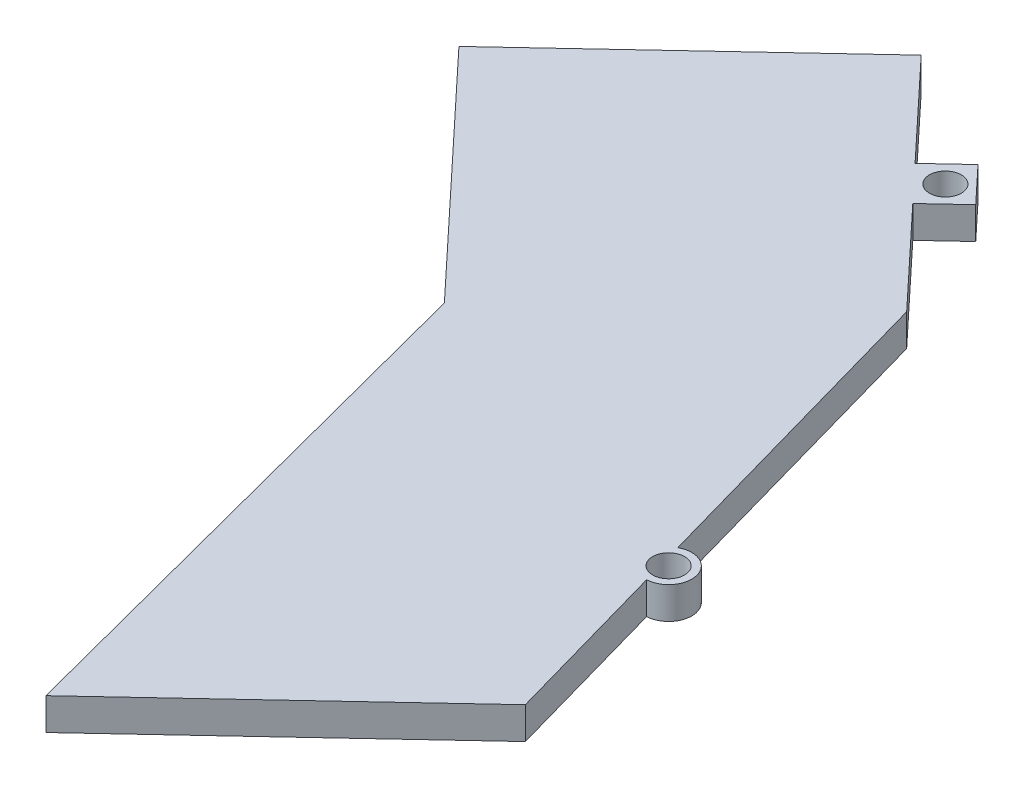
ISO-10303-21;
HEADER;
FILE_DESCRIPTION(('STEP AP214'),'2;1');
FILE_NAME('part.step','',(''),(''),'','','');
FILE_SCHEMA(('AUTOMOTIVE_DESIGN { 1 0 10303 214 1 1 1 1 }'));
ENDSEC;
DATA;
#1=APPLICATION_CONTEXT('core data for automotive mechanical design processes');
#2=APPLICATION_PROTOCOL_DEFINITION('international standard','automotive_design',2000,#1);
#3=PRODUCT_CONTEXT('',#1,'mechanical');
#4=PRODUCT('Part','Part','',(#3));
#5=PRODUCT_RELATED_PRODUCT_CATEGORY('part','',(#4));
#6=PRODUCT_DEFINITION_FORMATION('','',#4);
#7=PRODUCT_DEFINITION_CONTEXT('part definition',#1,'design');
#8=PRODUCT_DEFINITION('design','',#6,#7);
#9=PRODUCT_DEFINITION_SHAPE('','',#8);
#10=(LENGTH_UNIT() NAMED_UNIT(*) SI_UNIT(.MILLI.,.METRE.));
#11=(NAMED_UNIT(*) PLANE_ANGLE_UNIT() SI_UNIT($,.RADIAN.));
#12=(NAMED_UNIT(*) SI_UNIT($,.STERADIAN.) SOLID_ANGLE_UNIT());
#13=UNCERTAINTY_MEASURE_WITH_UNIT(LENGTH_MEASURE(1.E-05),#10,'distance_accuracy_value','');
#14=(GEOMETRIC_REPRESENTATION_CONTEXT(3) GLOBAL_UNCERTAINTY_ASSIGNED_CONTEXT((#13)) GLOBAL_UNIT_ASSIGNED_CONTEXT((#10,
#11,#12)) REPRESENTATION_CONTEXT('',''));
#15=CARTESIAN_POINT('',(0.,0.,0.));
#16=DIRECTION('',(0.,0.,1.));
#17=DIRECTION('',(1.,0.,0.));
#18=AXIS2_PLACEMENT_3D('',#15,#16,#17);
#19=CARTESIAN_POINT('',(50.3088874652439,6.35,14.3896305816045));
#20=DIRECTION('',(0.,1.,0.));
#21=DIRECTION('',(0.,0.,1.));
#22=AXIS2_PLACEMENT_3D('',#19,#20,#21);
#23=PLANE('',#22);
#24=CARTESIAN_POINT('',(50.3088874652439,6.35,14.3896305816045));
#25=DIRECTION('',(0.,1.,0.));
#26=DIRECTION('',(0.,0.,1.));
#27=AXIS2_PLACEMENT_3D('',#24,#25,#26);
#28=CIRCLE('',#27,3.175);
#29=CARTESIAN_POINT('',(50.3088874652439,6.35,17.5646305816045));
#30=VERTEX_POINT('',#29);
#31=EDGE_CURVE('E170',#30,#30,#28,.T.);
#32=ORIENTED_EDGE('',*,*,#31,.F.);
#33=EDGE_LOOP('',(#32));
#34=FACE_BOUND('',#33,.T.);
#35=DIRECTION('',(0.252771208119305,0.,0.967526080447399));
#36=VECTOR('',#35,1.);
#37=CARTESIAN_POINT('',(-17.2524708254274,6.35,-8.57538036440728));
#38=LINE('',#37,#36);
#39=CARTESIAN_POINT('',(-17.2524708254274,6.35,-8.57538036440728));
#40=VERTEX_POINT('',#39);
#41=CARTESIAN_POINT('',(10.7658302249782,6.35,98.6695752529245));
#42=VERTEX_POINT('',#41);
#43=EDGE_CURVE('E200',#40,#42,#38,.T.);
#44=ORIENTED_EDGE('',*,*,#43,.T.);
#45=DIRECTION('',(0.729853070223348,0.,-0.68360404905585));
#46=VECTOR('',#45,1.);
#47=CARTESIAN_POINT('',(59.9923291745468,6.35,52.5624403025013));
#48=LINE('',#47,#46);
#49=CARTESIAN_POINT('',(59.9923291745468,6.35,52.5624403025013));
#50=VERTEX_POINT('',#49);
#51=EDGE_CURVE('E112',#42,#50,#48,.T.);
#52=ORIENTED_EDGE('',*,*,#51,.T.);
#53=DIRECTION('',(-0.27136827073141,0.,-0.962475590152937));
#54=VECTOR('',#53,1.);
#55=CARTESIAN_POINT('',(59.9923291745468,6.35,52.5624403025013));
#56=LINE('',#55,#54);
#57=CARTESIAN_POINT('',(50.5252422759883,6.35,18.9850437072384));
#58=VERTEX_POINT('',#57);
#59=EDGE_CURVE('E237',#50,#58,#56,.T.);
#60=ORIENTED_EDGE('',*,*,#59,.T.);
#61=CARTESIAN_POINT('',(50.3088874652439,6.35,14.3896305816045));
#62=DIRECTION('',(0.,1.,0.));
#63=DIRECTION('',(0.,0.,1.));
#64=AXIS2_PLACEMENT_3D('',#61,#62,#63);
#65=CIRCLE('',#64,4.60050336369626);
#66=CARTESIAN_POINT('',(48.0928681726231,6.35,10.3580192791457));
#67=VERTEX_POINT('',#66);
#68=EDGE_CURVE('E257',#58,#67,#65,.T.);
#69=ORIENTED_EDGE('',*,*,#68,.T.);
#70=DIRECTION('',(-0.27136827073141,0.,-0.962475590152937));
#71=VECTOR('',#70,1.);
#72=CARTESIAN_POINT('',(48.0928681726231,6.35,10.3580192791457));
#73=LINE('',#72,#71);
#74=CARTESIAN_POINT('',(30.2184264468101,6.35,-53.0381685004263));
#75=VERTEX_POINT('',#74);
#76=EDGE_CURVE('E253',#67,#75,#73,.T.);
#77=ORIENTED_EDGE('',*,*,#76,.T.);
#78=DIRECTION('',(-0.68360404905585,0.,-0.729853070223348));
#79=VECTOR('',#78,1.);
#80=CARTESIAN_POINT('',(30.2184264468101,6.35,-53.0381685004263));
#81=LINE('',#80,#79);
#82=CARTESIAN_POINT('',(12.1908532881216,6.35,-72.2853915628366));
#83=VERTEX_POINT('',#82);
#84=EDGE_CURVE('E256',#75,#83,#81,.T.);
#85=ORIENTED_EDGE('',*,*,#84,.T.);
#86=DIRECTION('',(0.729853070223348,0.,-0.68360404905585));
#87=VECTOR('',#86,1.);
#88=CARTESIAN_POINT('',(18.6535487188026,6.35,-78.338561638392));
#89=LINE('',#88,#87);
#90=CARTESIAN_POINT('',(18.6535487188026,6.35,-78.338561638392));
#91=VERTEX_POINT('',#90);
#92=EDGE_CURVE('E261',#83,#91,#89,.T.);
#93=ORIENTED_EDGE('',*,*,#92,.T.);
#94=DIRECTION('',(-0.68360404905585,0.,-0.729853070223347));
#95=VECTOR('',#94,1.);
#96=CARTESIAN_POINT('',(18.6535487188026,6.35,-78.338561638392));
#97=LINE('',#96,#95);
#98=CARTESIAN_POINT('',(11.9688399985394,6.35,-85.47552226607));
#99=VERTEX_POINT('',#98);
#100=EDGE_CURVE('E268',#91,#99,#97,.T.);
#101=ORIENTED_EDGE('',*,*,#100,.T.);
#102=DIRECTION('',(-0.729853070223348,0.,0.68360404905585));
#103=VECTOR('',#102,1.);
#104=CARTESIAN_POINT('',(11.9688399985394,6.35,-85.47552226607));
#105=LINE('',#104,#103);
#106=CARTESIAN_POINT('',(5.50614456785843,6.35,-79.4223521905145));
#107=VERTEX_POINT('',#106);
#108=EDGE_CURVE('E143',#99,#107,#105,.T.);
#109=ORIENTED_EDGE('',*,*,#108,.T.);
#110=DIRECTION('',(-0.68360404905585,0.,-0.729853070223348));
#111=VECTOR('',#110,1.);
#112=CARTESIAN_POINT('',(5.50614456785843,6.35,-79.4223521905145));
#113=LINE('',#112,#111);
#114=CARTESIAN_POINT('',(-12.52142859083,6.35,-98.6695752529248));
#115=VERTEX_POINT('',#114);
#116=EDGE_CURVE('E137',#107,#115,#113,.T.);
#117=ORIENTED_EDGE('',*,*,#116,.T.);
#118=DIRECTION('',(-0.729853070223348,0.,0.68360404905585));
#119=VECTOR('',#118,1.);
#120=CARTESIAN_POINT('',(-12.52142859083,6.35,-98.6695752529248));
#121=LINE('',#120,#119);
#122=CARTESIAN_POINT('',(-59.9923291745466,6.35,-54.206790652422));
#123=VERTEX_POINT('',#122);
#124=EDGE_CURVE('E141',#115,#123,#121,.T.);
#125=ORIENTED_EDGE('',*,*,#124,.T.);
#126=DIRECTION('',(0.68360404905585,0.,0.729853070223348));
#127=VECTOR('',#126,1.);
#128=CARTESIAN_POINT('',(-59.9923291745466,6.35,-54.206790652422));
#129=LINE('',#128,#127);
#130=EDGE_CURVE('E57',#123,#40,#129,.T.);
#131=ORIENTED_EDGE('',*,*,#130,.T.);
#132=EDGE_LOOP('',(#44,#52,#60,#69,#77,#85,#93,#101,#109,#117,#125,#131));
#133=FACE_BOUND('',#132,.T.);
#134=CARTESIAN_POINT('',(12.0799481671855,6.35,-78.880545367834));
#135=DIRECTION('',(0.,1.,0.));
#136=DIRECTION('',(0.,0.,1.));
#137=AXIS2_PLACEMENT_3D('',#134,#135,#136);
#138=CIRCLE('',#137,3.17500000000008);
#139=CARTESIAN_POINT('',(12.0799481671855,6.35,-75.7055453678339));
#140=VERTEX_POINT('',#139);
#141=EDGE_CURVE('E312',#140,#140,#138,.T.);
#142=ORIENTED_EDGE('',*,*,#141,.F.);
#143=EDGE_LOOP('',(#142));
#144=FACE_BOUND('',#143,.T.);
#145=ADVANCED_FACE('F39',(#34,#133,#144),#23,.T.);
#146=CARTESIAN_POINT('',(50.3088874652439,0.,14.3896305816045));
#147=DIRECTION('',(0.,1.,0.));
#148=DIRECTION('',(0.,0.,1.));
#149=AXIS2_PLACEMENT_3D('',#146,#147,#148);
#150=PLANE('',#149);
#151=DIRECTION('',(0.252771208119305,0.,0.967526080447399));
#152=VECTOR('',#151,1.);
#153=CARTESIAN_POINT('',(-17.2524708254274,0.,-8.57538036440728));
#154=LINE('',#153,#152);
#155=CARTESIAN_POINT('',(-17.2524708254274,0.,-8.57538036440728));
#156=VERTEX_POINT('',#155);
#157=CARTESIAN_POINT('',(10.7658302249782,0.,98.6695752529245));
#158=VERTEX_POINT('',#157);
#159=EDGE_CURVE('E165',#156,#158,#154,.T.);
#160=ORIENTED_EDGE('',*,*,#159,.F.);
#161=DIRECTION('',(0.68360404905585,0.,0.729853070223348));
#162=VECTOR('',#161,1.);
#163=CARTESIAN_POINT('',(-59.9923291745466,0.,-54.206790652422));
#164=LINE('',#163,#162);
#165=CARTESIAN_POINT('',(-59.9923291745466,0.,-54.206790652422));
#166=VERTEX_POINT('',#165);
#167=EDGE_CURVE('E104',#166,#156,#164,.T.);
#168=ORIENTED_EDGE('',*,*,#167,.F.);
#169=DIRECTION('',(-0.729853070223348,0.,0.68360404905585));
#170=VECTOR('',#169,1.);
#171=CARTESIAN_POINT('',(-12.52142859083,0.,-98.6695752529248));
#172=LINE('',#171,#170);
#173=CARTESIAN_POINT('',(-12.52142859083,0.,-98.6695752529248));
#174=VERTEX_POINT('',#173);
#175=EDGE_CURVE('E98',#174,#166,#172,.T.);
#176=ORIENTED_EDGE('',*,*,#175,.F.);
#177=DIRECTION('',(-0.68360404905585,0.,-0.729853070223348));
#178=VECTOR('',#177,1.);
#179=CARTESIAN_POINT('',(5.50614456785843,0.,-79.4223521905145));
#180=LINE('',#179,#178);
#181=CARTESIAN_POINT('',(5.50614456785843,0.,-79.4223521905145));
#182=VERTEX_POINT('',#181);
#183=EDGE_CURVE('E152',#182,#174,#180,.T.);
#184=ORIENTED_EDGE('',*,*,#183,.F.);
#185=DIRECTION('',(-0.729853070223348,0.,0.68360404905585));
#186=VECTOR('',#185,1.);
#187=CARTESIAN_POINT('',(11.9688399985394,0.,-85.47552226607));
#188=LINE('',#187,#186);
#189=CARTESIAN_POINT('',(11.9688399985394,0.,-85.47552226607));
#190=VERTEX_POINT('',#189);
#191=EDGE_CURVE('E191',#190,#182,#188,.T.);
#192=ORIENTED_EDGE('',*,*,#191,.F.);
#193=DIRECTION('',(-0.68360404905585,0.,-0.729853070223347));
#194=VECTOR('',#193,1.);
#195=CARTESIAN_POINT('',(18.6535487188026,0.,-78.338561638392));
#196=LINE('',#195,#194);
#197=CARTESIAN_POINT('',(18.6535487188026,0.,-78.338561638392));
#198=VERTEX_POINT('',#197);
#199=EDGE_CURVE('E188',#198,#190,#196,.T.);
#200=ORIENTED_EDGE('',*,*,#199,.F.);
#201=DIRECTION('',(0.729853070223348,0.,-0.68360404905585));
#202=VECTOR('',#201,1.);
#203=CARTESIAN_POINT('',(18.6535487188026,0.,-78.338561638392));
#204=LINE('',#203,#202);
#205=CARTESIAN_POINT('',(12.1908532881216,0.,-72.2853915628366));
#206=VERTEX_POINT('',#205);
#207=EDGE_CURVE('E185',#206,#198,#204,.T.);
#208=ORIENTED_EDGE('',*,*,#207,.F.);
#209=DIRECTION('',(-0.68360404905585,0.,-0.729853070223348));
#210=VECTOR('',#209,1.);
#211=CARTESIAN_POINT('',(30.2184264468101,0.,-53.0381685004263));
#212=LINE('',#211,#210);
#213=CARTESIAN_POINT('',(30.2184264468101,0.,-53.0381685004263));
#214=VERTEX_POINT('',#213);
#215=EDGE_CURVE('E182',#214,#206,#212,.T.);
#216=ORIENTED_EDGE('',*,*,#215,.F.);
#217=DIRECTION('',(-0.27136827073141,0.,-0.962475590152937));
#218=VECTOR('',#217,1.);
#219=CARTESIAN_POINT('',(48.0928681726231,0.,10.3580192791457));
#220=LINE('',#219,#218);
#221=CARTESIAN_POINT('',(48.0928681726231,0.,10.3580192791457));
#222=VERTEX_POINT('',#221);
#223=EDGE_CURVE('E179',#222,#214,#220,.T.);
#224=ORIENTED_EDGE('',*,*,#223,.F.);
#225=CARTESIAN_POINT('',(50.3088874652439,0.,14.3896305816045));
#226=DIRECTION('',(0.,1.,0.));
#227=DIRECTION('',(0.,0.,1.));
#228=AXIS2_PLACEMENT_3D('',#225,#226,#227);
#229=CIRCLE('',#228,4.60050336369626);
#230=CARTESIAN_POINT('',(50.5252422759883,0.,18.9850437072384));
#231=VERTEX_POINT('',#230);
#232=EDGE_CURVE('E176',#231,#222,#229,.T.);
#233=ORIENTED_EDGE('',*,*,#232,.F.);
#234=DIRECTION('',(-0.27136827073141,0.,-0.962475590152937));
#235=VECTOR('',#234,1.);
#236=CARTESIAN_POINT('',(59.9923291745468,0.,52.5624403025013));
#237=LINE('',#236,#235);
#238=CARTESIAN_POINT('',(59.9923291745468,0.,52.5624403025013));
#239=VERTEX_POINT('',#238);
#240=EDGE_CURVE('E173',#239,#231,#237,.T.);
#241=ORIENTED_EDGE('',*,*,#240,.F.);
#242=DIRECTION('',(0.729853070223348,0.,-0.68360404905585));
#243=VECTOR('',#242,1.);
#244=CARTESIAN_POINT('',(59.9923291745468,0.,52.5624403025013));
#245=LINE('',#244,#243);
#246=EDGE_CURVE('E169',#158,#239,#245,.T.);
#247=ORIENTED_EDGE('',*,*,#246,.F.);
#248=EDGE_LOOP('',(#160,#168,#176,#184,#192,#200,#208,#216,#224,#233,#241,#247));
#249=FACE_BOUND('',#248,.T.);
#250=CARTESIAN_POINT('',(50.3088874652439,0.,14.3896305816045));
#251=DIRECTION('',(0.,1.,0.));
#252=DIRECTION('',(0.,0.,1.));
#253=AXIS2_PLACEMENT_3D('',#250,#251,#252);
#254=CIRCLE('',#253,3.175);
#255=CARTESIAN_POINT('',(50.3088874652439,0.,17.5646305816045));
#256=VERTEX_POINT('',#255);
#257=EDGE_CURVE('E320',#256,#256,#254,.T.);
#258=ORIENTED_EDGE('',*,*,#257,.T.);
#259=EDGE_LOOP('',(#258));
#260=FACE_BOUND('',#259,.T.);
#261=CARTESIAN_POINT('',(12.0799481671855,0.,-78.880545367834));
#262=DIRECTION('',(0.,1.,0.));
#263=DIRECTION('',(0.,0.,1.));
#264=AXIS2_PLACEMENT_3D('',#261,#262,#263);
#265=CIRCLE('',#264,3.17500000000008);
#266=CARTESIAN_POINT('',(12.0799481671855,0.,-75.7055453678339));
#267=VERTEX_POINT('',#266);
#268=EDGE_CURVE('E315',#267,#267,#265,.T.);
#269=ORIENTED_EDGE('',*,*,#268,.T.);
#270=EDGE_LOOP('',(#269));
#271=FACE_BOUND('',#270,.T.);
#272=ADVANCED_FACE('F241',(#249,#260,#271),#150,.F.);
#273=CARTESIAN_POINT('',(-17.2524708254274,6.35,-8.57538036440728));
#274=DIRECTION('',(0.967526080447399,0.,-0.252771208119305));
#275=DIRECTION('',(-0.252771208119305,0.,-0.967526080447399));
#276=AXIS2_PLACEMENT_3D('',#273,#274,#275);
#277=PLANE('',#276);
#278=ORIENTED_EDGE('',*,*,#159,.T.);
#279=DIRECTION('',(0.,-1.,0.));
#280=VECTOR('',#279,1.);
#281=CARTESIAN_POINT('',(10.7658302249782,6.35,98.6695752529245));
#282=LINE('',#281,#280);
#283=EDGE_CURVE('E11',#42,#158,#282,.T.);
#284=ORIENTED_EDGE('',*,*,#283,.F.);
#285=ORIENTED_EDGE('',*,*,#43,.F.);
#286=DIRECTION('',(0.,-1.,0.));
#287=VECTOR('',#286,1.);
#288=CARTESIAN_POINT('',(-17.2524708254274,6.35,-8.57538036440728));
#289=LINE('',#288,#287);
#290=EDGE_CURVE('E161',#40,#156,#289,.T.);
#291=ORIENTED_EDGE('',*,*,#290,.T.);
#292=EDGE_LOOP('',(#278,#284,#285,#291));
#293=FACE_BOUND('',#292,.T.);
#294=ADVANCED_FACE('F41',(#293),#277,.F.);
#295=CARTESIAN_POINT('',(59.9923291745468,6.35,52.5624403025013));
#296=DIRECTION('',(-0.68360404905585,0.,-0.729853070223348));
#297=DIRECTION('',(-0.729853070223348,0.,0.68360404905585));
#298=AXIS2_PLACEMENT_3D('',#295,#296,#297);
#299=PLANE('',#298);
#300=ORIENTED_EDGE('',*,*,#246,.T.);
#301=DIRECTION('',(0.,-1.,0.));
#302=VECTOR('',#301,1.);
#303=CARTESIAN_POINT('',(59.9923291745468,6.35,52.5624403025013));
#304=LINE('',#303,#302);
#305=EDGE_CURVE('E49',#50,#239,#304,.T.);
#306=ORIENTED_EDGE('',*,*,#305,.F.);
#307=ORIENTED_EDGE('',*,*,#51,.F.);
#308=ORIENTED_EDGE('',*,*,#283,.T.);
#309=EDGE_LOOP('',(#300,#306,#307,#308));
#310=FACE_BOUND('',#309,.T.);
#311=ADVANCED_FACE('F418',(#310),#299,.F.);
#312=CARTESIAN_POINT('',(59.9923291745468,6.35,52.5624403025013));
#313=DIRECTION('',(-0.962475590152937,0.,0.27136827073141));
#314=DIRECTION('',(0.27136827073141,0.,0.962475590152937));
#315=AXIS2_PLACEMENT_3D('',#312,#313,#314);
#316=PLANE('',#315);
#317=ORIENTED_EDGE('',*,*,#240,.T.);
#318=DIRECTION('',(0.,-1.,0.));
#319=VECTOR('',#318,1.);
#320=CARTESIAN_POINT('',(50.5252422759883,6.35,18.9850437072384));
#321=LINE('',#320,#319);
#322=EDGE_CURVE('E227',#58,#231,#321,.T.);
#323=ORIENTED_EDGE('',*,*,#322,.F.);
#324=ORIENTED_EDGE('',*,*,#59,.F.);
#325=ORIENTED_EDGE('',*,*,#305,.T.);
#326=EDGE_LOOP('',(#317,#323,#324,#325));
#327=FACE_BOUND('',#326,.T.);
#328=ADVANCED_FACE('F235',(#327),#316,.F.);
#329=CARTESIAN_POINT('',(50.3088874652439,6.35,14.3896305816045));
#330=DIRECTION('',(0.,-1.,0.));
#331=DIRECTION('',(0.,0.,-1.));
#332=AXIS2_PLACEMENT_3D('',#329,#330,#331);
#333=CYLINDRICAL_SURFACE('',#332,4.60050336369626);
#334=ORIENTED_EDGE('',*,*,#232,.T.);
#335=DIRECTION('',(0.,-1.,0.));
#336=VECTOR('',#335,1.);
#337=CARTESIAN_POINT('',(48.0928681726231,6.35,10.3580192791457));
#338=LINE('',#337,#336);
#339=EDGE_CURVE('E223',#67,#222,#338,.T.);
#340=ORIENTED_EDGE('',*,*,#339,.F.);
#341=ORIENTED_EDGE('',*,*,#68,.F.);
#342=ORIENTED_EDGE('',*,*,#322,.T.);
#343=EDGE_LOOP('',(#334,#340,#341,#342));
#344=FACE_BOUND('',#343,.T.);
#345=ADVANCED_FACE('F247',(#344),#333,.T.);
#346=CARTESIAN_POINT('',(48.0928681726231,6.35,10.3580192791457));
#347=DIRECTION('',(-0.962475590152937,0.,0.27136827073141));
#348=DIRECTION('',(0.27136827073141,0.,0.962475590152937));
#349=AXIS2_PLACEMENT_3D('',#346,#347,#348);
#350=PLANE('',#349);
#351=ORIENTED_EDGE('',*,*,#223,.T.);
#352=DIRECTION('',(0.,-1.,0.));
#353=VECTOR('',#352,1.);
#354=CARTESIAN_POINT('',(30.2184264468101,6.35,-53.0381685004263));
#355=LINE('',#354,#353);
#356=EDGE_CURVE('E219',#75,#214,#355,.T.);
#357=ORIENTED_EDGE('',*,*,#356,.F.);
#358=ORIENTED_EDGE('',*,*,#76,.F.);
#359=ORIENTED_EDGE('',*,*,#339,.T.);
#360=EDGE_LOOP('',(#351,#357,#358,#359));
#361=FACE_BOUND('',#360,.T.);
#362=ADVANCED_FACE('F251',(#361),#350,.F.);
#363=CARTESIAN_POINT('',(30.2184264468101,6.35,-53.0381685004263));
#364=DIRECTION('',(-0.729853070223348,0.,0.683604049055849));
#365=DIRECTION('',(0.68360404905585,0.,0.729853070223348));
#366=AXIS2_PLACEMENT_3D('',#363,#364,#365);
#367=PLANE('',#366);
#368=ORIENTED_EDGE('',*,*,#215,.T.);
#369=DIRECTION('',(0.,-1.,0.));
#370=VECTOR('',#369,1.);
#371=CARTESIAN_POINT('',(12.1908532881216,6.35,-72.2853915628366));
#372=LINE('',#371,#370);
#373=EDGE_CURVE('E215',#83,#206,#372,.T.);
#374=ORIENTED_EDGE('',*,*,#373,.F.);
#375=ORIENTED_EDGE('',*,*,#84,.F.);
#376=ORIENTED_EDGE('',*,*,#356,.T.);
#377=EDGE_LOOP('',(#368,#374,#375,#376));
#378=FACE_BOUND('',#377,.T.);
#379=ADVANCED_FACE('F383',(#378),#367,.F.);
#380=CARTESIAN_POINT('',(18.6535487188026,6.35,-78.338561638392));
#381=DIRECTION('',(-0.683604049055849,0.,-0.729853070223348));
#382=DIRECTION('',(-0.729853070223348,0.,0.683604049055849));
#383=AXIS2_PLACEMENT_3D('',#380,#381,#382);
#384=PLANE('',#383);
#385=ORIENTED_EDGE('',*,*,#207,.T.);
#386=DIRECTION('',(0.,-1.,0.));
#387=VECTOR('',#386,1.);
#388=CARTESIAN_POINT('',(18.6535487188026,6.35,-78.338561638392));
#389=LINE('',#388,#387);
#390=EDGE_CURVE('E211',#91,#198,#389,.T.);
#391=ORIENTED_EDGE('',*,*,#390,.F.);
#392=ORIENTED_EDGE('',*,*,#92,.F.);
#393=ORIENTED_EDGE('',*,*,#373,.T.);
#394=EDGE_LOOP('',(#385,#391,#392,#393));
#395=FACE_BOUND('',#394,.T.);
#396=ADVANCED_FACE('F374',(#395),#384,.F.);
#397=CARTESIAN_POINT('',(18.6535487188026,6.35,-78.338561638392));
#398=DIRECTION('',(-0.729853070223347,0.,0.68360404905585));
#399=DIRECTION('',(0.68360404905585,0.,0.729853070223347));
#400=AXIS2_PLACEMENT_3D('',#397,#398,#399);
#401=PLANE('',#400);
#402=ORIENTED_EDGE('',*,*,#199,.T.);
#403=DIRECTION('',(0.,-1.,0.));
#404=VECTOR('',#403,1.);
#405=CARTESIAN_POINT('',(11.9688399985394,6.35,-85.47552226607));
#406=LINE('',#405,#404);
#407=EDGE_CURVE('E207',#99,#190,#406,.T.);
#408=ORIENTED_EDGE('',*,*,#407,.F.);
#409=ORIENTED_EDGE('',*,*,#100,.F.);
#410=ORIENTED_EDGE('',*,*,#390,.T.);
#411=EDGE_LOOP('',(#402,#408,#409,#410));
#412=FACE_BOUND('',#411,.T.);
#413=ADVANCED_FACE('F276',(#412),#401,.F.);
#414=CARTESIAN_POINT('',(11.9688399985394,6.35,-85.47552226607));
#415=DIRECTION('',(0.68360404905585,0.,0.729853070223348));
#416=DIRECTION('',(0.729853070223348,0.,-0.68360404905585));
#417=AXIS2_PLACEMENT_3D('',#414,#415,#416);
#418=PLANE('',#417);
#419=ORIENTED_EDGE('',*,*,#191,.T.);
#420=DIRECTION('',(0.,-1.,0.));
#421=VECTOR('',#420,1.);
#422=CARTESIAN_POINT('',(5.50614456785843,6.35,-79.4223521905145));
#423=LINE('',#422,#421);
#424=EDGE_CURVE('E154',#107,#182,#423,.T.);
#425=ORIENTED_EDGE('',*,*,#424,.F.);
#426=ORIENTED_EDGE('',*,*,#108,.F.);
#427=ORIENTED_EDGE('',*,*,#407,.T.);
#428=EDGE_LOOP('',(#419,#425,#426,#427));
#429=FACE_BOUND('',#428,.T.);
#430=ADVANCED_FACE('F280',(#429),#418,.F.);
#431=CARTESIAN_POINT('',(5.50614456785843,6.35,-79.4223521905145));
#432=DIRECTION('',(-0.729853070223348,0.,0.683604049055849));
#433=DIRECTION('',(0.683604049055849,0.,0.729853070223348));
#434=AXIS2_PLACEMENT_3D('',#431,#432,#433);
#435=PLANE('',#434);
#436=ORIENTED_EDGE('',*,*,#183,.T.);
#437=DIRECTION('',(0.,-1.,0.));
#438=VECTOR('',#437,1.);
#439=CARTESIAN_POINT('',(-12.52142859083,6.35,-98.6695752529248));
#440=LINE('',#439,#438);
#441=EDGE_CURVE('E149',#115,#174,#440,.T.);
#442=ORIENTED_EDGE('',*,*,#441,.F.);
#443=ORIENTED_EDGE('',*,*,#116,.F.);
#444=ORIENTED_EDGE('',*,*,#424,.T.);
#445=EDGE_LOOP('',(#436,#442,#443,#444));
#446=FACE_BOUND('',#445,.T.);
#447=ADVANCED_FACE('F150',(#446),#435,.F.);
#448=CARTESIAN_POINT('',(-12.52142859083,6.35,-98.6695752529248));
#449=DIRECTION('',(0.68360404905585,0.,0.729853070223348));
#450=DIRECTION('',(0.729853070223348,0.,-0.68360404905585));
#451=AXIS2_PLACEMENT_3D('',#448,#449,#450);
#452=PLANE('',#451);
#453=ORIENTED_EDGE('',*,*,#175,.T.);
#454=DIRECTION('',(0.,-1.,0.));
#455=VECTOR('',#454,1.);
#456=CARTESIAN_POINT('',(-59.9923291745466,6.35,-54.206790652422));
#457=LINE('',#456,#455);
#458=EDGE_CURVE('E155',#123,#166,#457,.T.);
#459=ORIENTED_EDGE('',*,*,#458,.F.);
#460=ORIENTED_EDGE('',*,*,#124,.F.);
#461=ORIENTED_EDGE('',*,*,#441,.T.);
#462=EDGE_LOOP('',(#453,#459,#460,#461));
#463=FACE_BOUND('',#462,.T.);
#464=ADVANCED_FACE('F157',(#463),#452,.F.);
#465=CARTESIAN_POINT('',(-59.9923291745466,6.35,-54.206790652422));
#466=DIRECTION('',(0.729853070223348,0.,-0.683604049055849));
#467=DIRECTION('',(-0.68360404905585,0.,-0.729853070223348));
#468=AXIS2_PLACEMENT_3D('',#465,#466,#467);
#469=PLANE('',#468);
#470=ORIENTED_EDGE('',*,*,#167,.T.);
#471=ORIENTED_EDGE('',*,*,#290,.F.);
#472=ORIENTED_EDGE('',*,*,#130,.F.);
#473=ORIENTED_EDGE('',*,*,#458,.T.);
#474=EDGE_LOOP('',(#470,#471,#472,#473));
#475=FACE_BOUND('',#474,.T.);
#476=ADVANCED_FACE('F284',(#475),#469,.F.);
#477=CARTESIAN_POINT('',(50.3088874652439,6.35,14.3896305816045));
#478=DIRECTION('',(0.,-1.,0.));
#479=DIRECTION('',(0.,0.,-1.));
#480=AXIS2_PLACEMENT_3D('',#477,#478,#479);
#481=CYLINDRICAL_SURFACE('',#480,3.175);
#482=ORIENTED_EDGE('',*,*,#31,.T.);
#483=EDGE_LOOP('',(#482));
#484=FACE_BOUND('',#483,.T.);
#485=ORIENTED_EDGE('',*,*,#257,.F.);
#486=EDGE_LOOP('',(#485));
#487=FACE_BOUND('',#486,.T.);
#488=ADVANCED_FACE('F286',(#484,#487),#481,.F.);
#489=CARTESIAN_POINT('',(12.0799481671855,6.35,-78.880545367834));
#490=DIRECTION('',(0.,-1.,0.));
#491=DIRECTION('',(0.,0.,-1.));
#492=AXIS2_PLACEMENT_3D('',#489,#490,#491);
#493=CYLINDRICAL_SURFACE('',#492,3.17500000000008);
#494=ORIENTED_EDGE('',*,*,#141,.T.);
#495=EDGE_LOOP('',(#494));
#496=FACE_BOUND('',#495,.T.);
#497=ORIENTED_EDGE('',*,*,#268,.F.);
#498=EDGE_LOOP('',(#497));
#499=FACE_BOUND('',#498,.T.);
#500=ADVANCED_FACE('F292',(#496,#499),#493,.F.);
#501=CLOSED_SHELL('',(#145,#272,#294,#311,#328,#345,#362,#379,#396,#413,#430,#447,#464,#476,
#488,#500));
#502=MANIFOLD_SOLID_BREP('B2',#501);
#503=ADVANCED_BREP_SHAPE_REPRESENTATION('',(#18,#502),#14);
#504=SHAPE_DEFINITION_REPRESENTATION(#9,#503);
ENDSEC;
END-ISO-10303-21;
